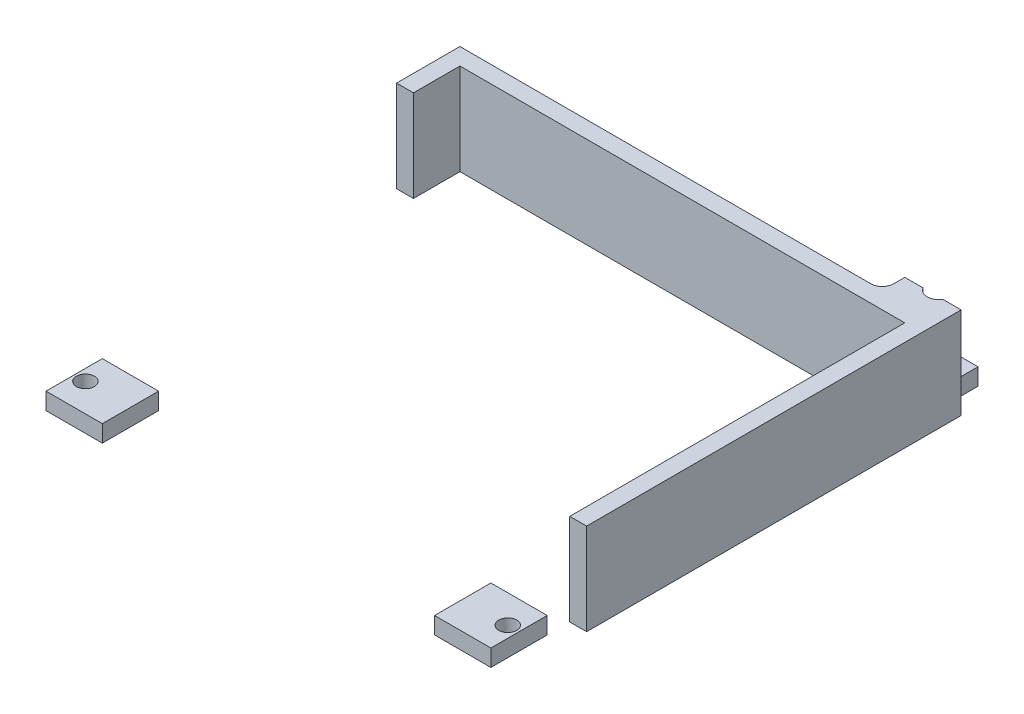
ISO-10303-21;
HEADER;
FILE_DESCRIPTION(('STEP AP214'),'2;1');
FILE_NAME('part.step','',(''),(''),'','','');
FILE_SCHEMA(('AUTOMOTIVE_DESIGN { 1 0 10303 214 1 1 1 1 }'));
ENDSEC;
DATA;
#1=APPLICATION_CONTEXT('core data for automotive mechanical design processes');
#2=APPLICATION_PROTOCOL_DEFINITION('international standard','automotive_design',2000,#1);
#3=PRODUCT_CONTEXT('',#1,'mechanical');
#4=PRODUCT('Part','Part','',(#3));
#5=PRODUCT_RELATED_PRODUCT_CATEGORY('part','',(#4));
#6=PRODUCT_DEFINITION_FORMATION('','',#4);
#7=PRODUCT_DEFINITION_CONTEXT('part definition',#1,'design');
#8=PRODUCT_DEFINITION('design','',#6,#7);
#9=PRODUCT_DEFINITION_SHAPE('','',#8);
#10=(LENGTH_UNIT() NAMED_UNIT(*) SI_UNIT(.MILLI.,.METRE.));
#11=(NAMED_UNIT(*) PLANE_ANGLE_UNIT() SI_UNIT($,.RADIAN.));
#12=(NAMED_UNIT(*) SI_UNIT($,.STERADIAN.) SOLID_ANGLE_UNIT());
#13=UNCERTAINTY_MEASURE_WITH_UNIT(LENGTH_MEASURE(1.E-05),#10,'distance_accuracy_value','');
#14=(GEOMETRIC_REPRESENTATION_CONTEXT(3) GLOBAL_UNCERTAINTY_ASSIGNED_CONTEXT((#13)) GLOBAL_UNIT_ASSIGNED_CONTEXT((#10,
#11,#12)) REPRESENTATION_CONTEXT('',''));
#15=CARTESIAN_POINT('',(0.,0.,0.));
#16=DIRECTION('',(0.,0.,1.));
#17=DIRECTION('',(1.,0.,0.));
#18=AXIS2_PLACEMENT_3D('',#15,#16,#17);
#19=CARTESIAN_POINT('',(29.5,11.6,33.25));
#20=DIRECTION('',(0.,0.,-1.));
#21=DIRECTION('',(-1.,0.,0.));
#22=AXIS2_PLACEMENT_3D('',#19,#20,#21);
#23=PLANE('',#22);
#24=DIRECTION('',(1.,0.,0.));
#25=VECTOR('',#24,1.);
#26=CARTESIAN_POINT('',(29.5,8.6,33.25));
#27=LINE('',#26,#25);
#28=CARTESIAN_POINT('',(29.5,8.6,33.25));
#29=VERTEX_POINT('',#28);
#30=CARTESIAN_POINT('',(39.5,8.6,33.25));
#31=VERTEX_POINT('',#30);
#32=EDGE_CURVE('E12',#29,#31,#27,.T.);
#33=ORIENTED_EDGE('',*,*,#32,.F.);
#34=DIRECTION('',(0.,-1.,0.));
#35=VECTOR('',#34,1.);
#36=CARTESIAN_POINT('',(29.5,11.6,33.25));
#37=LINE('',#36,#35);
#38=CARTESIAN_POINT('',(29.5,11.6,33.25));
#39=VERTEX_POINT('',#38);
#40=EDGE_CURVE('E100',#39,#29,#37,.T.);
#41=ORIENTED_EDGE('',*,*,#40,.F.);
#42=DIRECTION('',(1.,0.,0.));
#43=VECTOR('',#42,1.);
#44=CARTESIAN_POINT('',(29.5,11.6,33.25));
#45=LINE('',#44,#43);
#46=CARTESIAN_POINT('',(39.5,11.6,33.25));
#47=VERTEX_POINT('',#46);
#48=EDGE_CURVE('E56',#39,#47,#45,.T.);
#49=ORIENTED_EDGE('',*,*,#48,.T.);
#50=DIRECTION('',(0.,-1.,0.));
#51=VECTOR('',#50,1.);
#52=CARTESIAN_POINT('',(39.5,11.6,33.25));
#53=LINE('',#52,#51);
#54=EDGE_CURVE('E71',#47,#31,#53,.T.);
#55=ORIENTED_EDGE('',*,*,#54,.T.);
#56=EDGE_LOOP('',(#33,#41,#49,#55));
#57=FACE_BOUND('',#56,.T.);
#58=ADVANCED_FACE('F52',(#57),#23,.T.);
#59=CARTESIAN_POINT('',(29.5,11.6,43.25));
#60=DIRECTION('',(-1.,0.,0.));
#61=DIRECTION('',(0.,0.,1.));
#62=AXIS2_PLACEMENT_3D('',#59,#60,#61);
#63=PLANE('',#62);
#64=DIRECTION('',(0.,0.,-1.));
#65=VECTOR('',#64,1.);
#66=CARTESIAN_POINT('',(29.5,8.6,43.25));
#67=LINE('',#66,#65);
#68=CARTESIAN_POINT('',(29.5,8.6,43.25));
#69=VERTEX_POINT('',#68);
#70=EDGE_CURVE('E114',#69,#29,#67,.T.);
#71=ORIENTED_EDGE('',*,*,#70,.F.);
#72=DIRECTION('',(0.,-1.,0.));
#73=VECTOR('',#72,1.);
#74=CARTESIAN_POINT('',(29.5,11.6,43.25));
#75=LINE('',#74,#73);
#76=CARTESIAN_POINT('',(29.5,11.6,43.25));
#77=VERTEX_POINT('',#76);
#78=EDGE_CURVE('E103',#77,#69,#75,.T.);
#79=ORIENTED_EDGE('',*,*,#78,.F.);
#80=DIRECTION('',(0.,0.,-1.));
#81=VECTOR('',#80,1.);
#82=CARTESIAN_POINT('',(29.5,11.6,43.25));
#83=LINE('',#82,#81);
#84=EDGE_CURVE('E121',#77,#39,#83,.T.);
#85=ORIENTED_EDGE('',*,*,#84,.T.);
#86=ORIENTED_EDGE('',*,*,#40,.T.);
#87=EDGE_LOOP('',(#71,#79,#85,#86));
#88=FACE_BOUND('',#87,.T.);
#89=ADVANCED_FACE('F116',(#88),#63,.T.);
#90=CARTESIAN_POINT('',(29.5,11.6,43.25));
#91=DIRECTION('',(0.,0.,-1.));
#92=DIRECTION('',(-1.,0.,0.));
#93=AXIS2_PLACEMENT_3D('',#90,#91,#92);
#94=PLANE('',#93);
#95=DIRECTION('',(1.,0.,0.));
#96=VECTOR('',#95,1.);
#97=CARTESIAN_POINT('',(29.5,8.6,43.25));
#98=LINE('',#97,#96);
#99=CARTESIAN_POINT('',(39.5,8.6,43.25));
#100=VERTEX_POINT('',#99);
#101=EDGE_CURVE('E106',#69,#100,#98,.T.);
#102=ORIENTED_EDGE('',*,*,#101,.T.);
#103=DIRECTION('',(0.,-1.,0.));
#104=VECTOR('',#103,1.);
#105=CARTESIAN_POINT('',(39.5,11.6,43.25));
#106=LINE('',#105,#104);
#107=CARTESIAN_POINT('',(39.5,11.6,43.25));
#108=VERTEX_POINT('',#107);
#109=EDGE_CURVE('E108',#108,#100,#106,.T.);
#110=ORIENTED_EDGE('',*,*,#109,.F.);
#111=DIRECTION('',(1.,0.,0.));
#112=VECTOR('',#111,1.);
#113=CARTESIAN_POINT('',(29.5,11.6,43.25));
#114=LINE('',#113,#112);
#115=EDGE_CURVE('E89',#77,#108,#114,.T.);
#116=ORIENTED_EDGE('',*,*,#115,.F.);
#117=ORIENTED_EDGE('',*,*,#78,.T.);
#118=EDGE_LOOP('',(#102,#110,#116,#117));
#119=FACE_BOUND('',#118,.T.);
#120=ADVANCED_FACE('F105',(#119),#94,.F.);
#121=CARTESIAN_POINT('',(39.5,11.6,43.25));
#122=DIRECTION('',(-1.,0.,0.));
#123=DIRECTION('',(0.,0.,1.));
#124=AXIS2_PLACEMENT_3D('',#121,#122,#123);
#125=PLANE('',#124);
#126=DIRECTION('',(0.,0.,-1.));
#127=VECTOR('',#126,1.);
#128=CARTESIAN_POINT('',(39.5,8.6,43.25));
#129=LINE('',#128,#127);
#130=EDGE_CURVE('E62',#100,#31,#129,.T.);
#131=ORIENTED_EDGE('',*,*,#130,.T.);
#132=ORIENTED_EDGE('',*,*,#54,.F.);
#133=DIRECTION('',(0.,0.,-1.));
#134=VECTOR('',#133,1.);
#135=CARTESIAN_POINT('',(39.5,11.6,43.25));
#136=LINE('',#135,#134);
#137=EDGE_CURVE('E94',#108,#47,#136,.T.);
#138=ORIENTED_EDGE('',*,*,#137,.F.);
#139=ORIENTED_EDGE('',*,*,#109,.T.);
#140=EDGE_LOOP('',(#131,#132,#138,#139));
#141=FACE_BOUND('',#140,.T.);
#142=ADVANCED_FACE('F136',(#141),#125,.F.);
#143=CARTESIAN_POINT('',(0.,11.6,0.));
#144=DIRECTION('',(0.,1.,0.));
#145=DIRECTION('',(0.,0.,1.));
#146=AXIS2_PLACEMENT_3D('',#143,#144,#145);
#147=PLANE('',#146);
#148=CARTESIAN_POINT('',(37.5,11.6,38.25));
#149=DIRECTION('',(0.,1.,0.));
#150=DIRECTION('',(0.,0.,1.));
#151=AXIS2_PLACEMENT_3D('',#148,#149,#150);
#152=CIRCLE('',#151,1.6);
#153=CARTESIAN_POINT('',(37.5,11.6,39.85));
#154=VERTEX_POINT('',#153);
#155=EDGE_CURVE('E129',#154,#154,#152,.T.);
#156=ORIENTED_EDGE('',*,*,#155,.F.);
#157=EDGE_LOOP('',(#156));
#158=FACE_BOUND('',#157,.T.);
#159=ORIENTED_EDGE('',*,*,#48,.F.);
#160=ORIENTED_EDGE('',*,*,#84,.F.);
#161=ORIENTED_EDGE('',*,*,#115,.T.);
#162=ORIENTED_EDGE('',*,*,#137,.T.);
#163=EDGE_LOOP('',(#159,#160,#161,#162));
#164=FACE_BOUND('',#163,.T.);
#165=ADVANCED_FACE('F54',(#158,#164),#147,.T.);
#166=CARTESIAN_POINT('',(0.,8.6,0.));
#167=DIRECTION('',(0.,1.,0.));
#168=DIRECTION('',(0.,0.,1.));
#169=AXIS2_PLACEMENT_3D('',#166,#167,#168);
#170=PLANE('',#169);
#171=CARTESIAN_POINT('',(37.5,8.6,38.25));
#172=DIRECTION('',(0.,1.,0.));
#173=DIRECTION('',(0.,0.,1.));
#174=AXIS2_PLACEMENT_3D('',#171,#172,#173);
#175=CIRCLE('',#174,1.6);
#176=CARTESIAN_POINT('',(37.5,8.6,39.85));
#177=VERTEX_POINT('',#176);
#178=EDGE_CURVE('E126',#177,#177,#175,.T.);
#179=ORIENTED_EDGE('',*,*,#178,.T.);
#180=EDGE_LOOP('',(#179));
#181=FACE_BOUND('',#180,.T.);
#182=ORIENTED_EDGE('',*,*,#32,.T.);
#183=ORIENTED_EDGE('',*,*,#130,.F.);
#184=ORIENTED_EDGE('',*,*,#101,.F.);
#185=ORIENTED_EDGE('',*,*,#70,.T.);
#186=EDGE_LOOP('',(#182,#183,#184,#185));
#187=FACE_BOUND('',#186,.T.);
#188=ADVANCED_FACE('F113',(#181,#187),#170,.F.);
#189=CARTESIAN_POINT('',(37.5,11.6,38.25));
#190=DIRECTION('',(0.,1.,0.));
#191=DIRECTION('',(0.,0.,1.));
#192=AXIS2_PLACEMENT_3D('',#189,#190,#191);
#193=CYLINDRICAL_SURFACE('',#192,1.6);
#194=ORIENTED_EDGE('',*,*,#178,.F.);
#195=EDGE_LOOP('',(#194));
#196=FACE_BOUND('',#195,.T.);
#197=ORIENTED_EDGE('',*,*,#155,.T.);
#198=EDGE_LOOP('',(#197));
#199=FACE_BOUND('',#198,.T.);
#200=ADVANCED_FACE('F133',(#196,#199),#193,.F.);
#201=CLOSED_SHELL('',(#58,#89,#120,#142,#165,#188,#200));
#202=MANIFOLD_SOLID_BREP('B2',#201);
#203=CARTESIAN_POINT('',(-39.5,11.6,33.25));
#204=DIRECTION('',(0.,0.,-1.));
#205=DIRECTION('',(-1.,0.,0.));
#206=AXIS2_PLACEMENT_3D('',#203,#204,#205);
#207=PLANE('',#206);
#208=DIRECTION('',(1.,0.,0.));
#209=VECTOR('',#208,1.);
#210=CARTESIAN_POINT('',(-39.5,8.6,33.25));
#211=LINE('',#210,#209);
#212=CARTESIAN_POINT('',(-39.5,8.6,33.25));
#213=VERTEX_POINT('',#212);
#214=CARTESIAN_POINT('',(-29.5,8.6,33.25));
#215=VERTEX_POINT('',#214);
#216=EDGE_CURVE('E50',#213,#215,#211,.T.);
#217=ORIENTED_EDGE('',*,*,#216,.F.);
#218=DIRECTION('',(0.,-1.,0.));
#219=VECTOR('',#218,1.);
#220=CARTESIAN_POINT('',(-39.5,11.6,33.25));
#221=LINE('',#220,#219);
#222=CARTESIAN_POINT('',(-39.5,11.6,33.25));
#223=VERTEX_POINT('',#222);
#224=EDGE_CURVE('E268',#223,#213,#221,.T.);
#225=ORIENTED_EDGE('',*,*,#224,.F.);
#226=DIRECTION('',(1.,0.,0.));
#227=VECTOR('',#226,1.);
#228=CARTESIAN_POINT('',(-39.5,11.6,33.25));
#229=LINE('',#228,#227);
#230=CARTESIAN_POINT('',(-29.5,11.6,33.25));
#231=VERTEX_POINT('',#230);
#232=EDGE_CURVE('E224',#223,#231,#229,.T.);
#233=ORIENTED_EDGE('',*,*,#232,.T.);
#234=DIRECTION('',(0.,-1.,0.));
#235=VECTOR('',#234,1.);
#236=CARTESIAN_POINT('',(-29.5,11.6,33.25));
#237=LINE('',#236,#235);
#238=EDGE_CURVE('E239',#231,#215,#237,.T.);
#239=ORIENTED_EDGE('',*,*,#238,.T.);
#240=EDGE_LOOP('',(#217,#225,#233,#239));
#241=FACE_BOUND('',#240,.T.);
#242=ADVANCED_FACE('F220',(#241),#207,.T.);
#243=CARTESIAN_POINT('',(-39.5,11.6,43.25));
#244=DIRECTION('',(-1.,0.,0.));
#245=DIRECTION('',(0.,0.,1.));
#246=AXIS2_PLACEMENT_3D('',#243,#244,#245);
#247=PLANE('',#246);
#248=DIRECTION('',(0.,0.,-1.));
#249=VECTOR('',#248,1.);
#250=CARTESIAN_POINT('',(-39.5,8.6,43.25));
#251=LINE('',#250,#249);
#252=CARTESIAN_POINT('',(-39.5,8.6,43.25));
#253=VERTEX_POINT('',#252);
#254=EDGE_CURVE('E282',#253,#213,#251,.T.);
#255=ORIENTED_EDGE('',*,*,#254,.F.);
#256=DIRECTION('',(0.,-1.,0.));
#257=VECTOR('',#256,1.);
#258=CARTESIAN_POINT('',(-39.5,11.6,43.25));
#259=LINE('',#258,#257);
#260=CARTESIAN_POINT('',(-39.5,11.6,43.25));
#261=VERTEX_POINT('',#260);
#262=EDGE_CURVE('E271',#261,#253,#259,.T.);
#263=ORIENTED_EDGE('',*,*,#262,.F.);
#264=DIRECTION('',(0.,0.,-1.));
#265=VECTOR('',#264,1.);
#266=CARTESIAN_POINT('',(-39.5,11.6,43.25));
#267=LINE('',#266,#265);
#268=EDGE_CURVE('E289',#261,#223,#267,.T.);
#269=ORIENTED_EDGE('',*,*,#268,.T.);
#270=ORIENTED_EDGE('',*,*,#224,.T.);
#271=EDGE_LOOP('',(#255,#263,#269,#270));
#272=FACE_BOUND('',#271,.T.);
#273=ADVANCED_FACE('F284',(#272),#247,.T.);
#274=CARTESIAN_POINT('',(-39.5,11.6,43.25));
#275=DIRECTION('',(0.,0.,-1.));
#276=DIRECTION('',(-1.,0.,0.));
#277=AXIS2_PLACEMENT_3D('',#274,#275,#276);
#278=PLANE('',#277);
#279=DIRECTION('',(1.,0.,0.));
#280=VECTOR('',#279,1.);
#281=CARTESIAN_POINT('',(-39.5,8.6,43.25));
#282=LINE('',#281,#280);
#283=CARTESIAN_POINT('',(-29.5,8.6,43.25));
#284=VERTEX_POINT('',#283);
#285=EDGE_CURVE('E274',#253,#284,#282,.T.);
#286=ORIENTED_EDGE('',*,*,#285,.T.);
#287=DIRECTION('',(0.,-1.,0.));
#288=VECTOR('',#287,1.);
#289=CARTESIAN_POINT('',(-29.5,11.6,43.25));
#290=LINE('',#289,#288);
#291=CARTESIAN_POINT('',(-29.5,11.6,43.25));
#292=VERTEX_POINT('',#291);
#293=EDGE_CURVE('E276',#292,#284,#290,.T.);
#294=ORIENTED_EDGE('',*,*,#293,.F.);
#295=DIRECTION('',(1.,0.,0.));
#296=VECTOR('',#295,1.);
#297=CARTESIAN_POINT('',(-39.5,11.6,43.25));
#298=LINE('',#297,#296);
#299=EDGE_CURVE('E257',#261,#292,#298,.T.);
#300=ORIENTED_EDGE('',*,*,#299,.F.);
#301=ORIENTED_EDGE('',*,*,#262,.T.);
#302=EDGE_LOOP('',(#286,#294,#300,#301));
#303=FACE_BOUND('',#302,.T.);
#304=ADVANCED_FACE('F273',(#303),#278,.F.);
#305=CARTESIAN_POINT('',(-29.5,11.6,43.25));
#306=DIRECTION('',(-1.,0.,0.));
#307=DIRECTION('',(0.,0.,1.));
#308=AXIS2_PLACEMENT_3D('',#305,#306,#307);
#309=PLANE('',#308);
#310=DIRECTION('',(0.,0.,-1.));
#311=VECTOR('',#310,1.);
#312=CARTESIAN_POINT('',(-29.5,8.6,43.25));
#313=LINE('',#312,#311);
#314=EDGE_CURVE('E230',#284,#215,#313,.T.);
#315=ORIENTED_EDGE('',*,*,#314,.T.);
#316=ORIENTED_EDGE('',*,*,#238,.F.);
#317=DIRECTION('',(0.,0.,-1.));
#318=VECTOR('',#317,1.);
#319=CARTESIAN_POINT('',(-29.5,11.6,43.25));
#320=LINE('',#319,#318);
#321=EDGE_CURVE('E262',#292,#231,#320,.T.);
#322=ORIENTED_EDGE('',*,*,#321,.F.);
#323=ORIENTED_EDGE('',*,*,#293,.T.);
#324=EDGE_LOOP('',(#315,#316,#322,#323));
#325=FACE_BOUND('',#324,.T.);
#326=ADVANCED_FACE('F304',(#325),#309,.F.);
#327=CARTESIAN_POINT('',(0.,11.6,0.));
#328=DIRECTION('',(0.,1.,0.));
#329=DIRECTION('',(0.,0.,1.));
#330=AXIS2_PLACEMENT_3D('',#327,#328,#329);
#331=PLANE('',#330);
#332=CARTESIAN_POINT('',(-37.5,11.6,38.25));
#333=DIRECTION('',(0.,1.,0.));
#334=DIRECTION('',(0.,0.,1.));
#335=AXIS2_PLACEMENT_3D('',#332,#333,#334);
#336=CIRCLE('',#335,1.6);
#337=CARTESIAN_POINT('',(-37.5,11.6,39.85));
#338=VERTEX_POINT('',#337);
#339=EDGE_CURVE('E297',#338,#338,#336,.T.);
#340=ORIENTED_EDGE('',*,*,#339,.F.);
#341=EDGE_LOOP('',(#340));
#342=FACE_BOUND('',#341,.T.);
#343=ORIENTED_EDGE('',*,*,#232,.F.);
#344=ORIENTED_EDGE('',*,*,#268,.F.);
#345=ORIENTED_EDGE('',*,*,#299,.T.);
#346=ORIENTED_EDGE('',*,*,#321,.T.);
#347=EDGE_LOOP('',(#343,#344,#345,#346));
#348=FACE_BOUND('',#347,.T.);
#349=ADVANCED_FACE('F222',(#342,#348),#331,.T.);
#350=CARTESIAN_POINT('',(0.,8.6,0.));
#351=DIRECTION('',(0.,1.,0.));
#352=DIRECTION('',(0.,0.,1.));
#353=AXIS2_PLACEMENT_3D('',#350,#351,#352);
#354=PLANE('',#353);
#355=CARTESIAN_POINT('',(-37.5,8.6,38.25));
#356=DIRECTION('',(0.,1.,0.));
#357=DIRECTION('',(0.,0.,1.));
#358=AXIS2_PLACEMENT_3D('',#355,#356,#357);
#359=CIRCLE('',#358,1.6);
#360=CARTESIAN_POINT('',(-37.5,8.6,39.85));
#361=VERTEX_POINT('',#360);
#362=EDGE_CURVE('E294',#361,#361,#359,.T.);
#363=ORIENTED_EDGE('',*,*,#362,.T.);
#364=EDGE_LOOP('',(#363));
#365=FACE_BOUND('',#364,.T.);
#366=ORIENTED_EDGE('',*,*,#216,.T.);
#367=ORIENTED_EDGE('',*,*,#314,.F.);
#368=ORIENTED_EDGE('',*,*,#285,.F.);
#369=ORIENTED_EDGE('',*,*,#254,.T.);
#370=EDGE_LOOP('',(#366,#367,#368,#369));
#371=FACE_BOUND('',#370,.T.);
#372=ADVANCED_FACE('F281',(#365,#371),#354,.F.);
#373=CARTESIAN_POINT('',(-37.5,11.6,38.25));
#374=DIRECTION('',(0.,1.,0.));
#375=DIRECTION('',(0.,0.,1.));
#376=AXIS2_PLACEMENT_3D('',#373,#374,#375);
#377=CYLINDRICAL_SURFACE('',#376,1.6);
#378=ORIENTED_EDGE('',*,*,#362,.F.);
#379=EDGE_LOOP('',(#378));
#380=FACE_BOUND('',#379,.T.);
#381=ORIENTED_EDGE('',*,*,#339,.T.);
#382=EDGE_LOOP('',(#381));
#383=FACE_BOUND('',#382,.T.);
#384=ADVANCED_FACE('F301',(#380,#383),#377,.F.);
#385=CLOSED_SHELL('',(#242,#273,#304,#326,#349,#372,#384));
#386=MANIFOLD_SOLID_BREP('B6',#385);
#387=CARTESIAN_POINT('',(0.,24.85,-33.25));
#388=DIRECTION('',(0.,0.,1.));
#389=DIRECTION('',(1.,0.,0.));
#390=AXIS2_PLACEMENT_3D('',#387,#388,#389);
#391=PLANE('',#390);
#392=DIRECTION('',(0.,-1.,0.));
#393=VECTOR('',#392,1.);
#394=CARTESIAN_POINT('',(29.5,11.6,-33.25));
#395=LINE('',#394,#393);
#396=CARTESIAN_POINT('',(29.5,11.6,-33.25));
#397=VERTEX_POINT('',#396);
#398=CARTESIAN_POINT('',(29.5,8.6,-33.25));
#399=VERTEX_POINT('',#398);
#400=EDGE_CURVE('E551',#397,#399,#395,.T.);
#401=ORIENTED_EDGE('',*,*,#400,.T.);
#402=DIRECTION('',(-1.,0.,0.));
#403=VECTOR('',#402,1.);
#404=CARTESIAN_POINT('',(0.,8.6,-33.25));
#405=LINE('',#404,#403);
#406=CARTESIAN_POINT('',(-29.5,8.6,-33.25));
#407=VERTEX_POINT('',#406);
#408=EDGE_CURVE('E636',#399,#407,#405,.T.);
#409=ORIENTED_EDGE('',*,*,#408,.T.);
#410=DIRECTION('',(0.,-1.,0.));
#411=VECTOR('',#410,1.);
#412=CARTESIAN_POINT('',(-29.5,11.6,-33.25));
#413=LINE('',#412,#411);
#414=CARTESIAN_POINT('',(-29.5,11.6,-33.25));
#415=VERTEX_POINT('',#414);
#416=EDGE_CURVE('E593',#415,#407,#413,.T.);
#417=ORIENTED_EDGE('',*,*,#416,.F.);
#418=DIRECTION('',(1.,0.,0.));
#419=VECTOR('',#418,1.);
#420=CARTESIAN_POINT('',(-39.5,11.6,-33.25));
#421=LINE('',#420,#419);
#422=CARTESIAN_POINT('',(-39.5,11.6,-33.25));
#423=VERTEX_POINT('',#422);
#424=EDGE_CURVE('E573',#423,#415,#421,.T.);
#425=ORIENTED_EDGE('',*,*,#424,.F.);
#426=DIRECTION('',(0.,-1.,0.));
#427=VECTOR('',#426,1.);
#428=CARTESIAN_POINT('',(-39.5,11.6,-33.25));
#429=LINE('',#428,#427);
#430=CARTESIAN_POINT('',(-39.5,8.6,-33.25));
#431=VERTEX_POINT('',#430);
#432=EDGE_CURVE('E590',#423,#431,#429,.T.);
#433=ORIENTED_EDGE('',*,*,#432,.T.);
#434=CARTESIAN_POINT('',(-42.5,8.6,-33.25));
#435=VERTEX_POINT('',#434);
#436=EDGE_CURVE('E635',#431,#435,#405,.T.);
#437=ORIENTED_EDGE('',*,*,#436,.T.);
#438=DIRECTION('',(0.,-1.,0.));
#439=VECTOR('',#438,1.);
#440=CARTESIAN_POINT('',(-42.5,24.85,-33.25));
#441=LINE('',#440,#439);
#442=CARTESIAN_POINT('',(-42.5,24.85,-33.25));
#443=VERTEX_POINT('',#442);
#444=EDGE_CURVE('E656',#443,#435,#441,.T.);
#445=ORIENTED_EDGE('',*,*,#444,.F.);
#446=DIRECTION('',(-1.,0.,0.));
#447=VECTOR('',#446,1.);
#448=CARTESIAN_POINT('',(0.,24.85,-33.25));
#449=LINE('',#448,#447);
#450=CARTESIAN_POINT('',(30.5,24.85,-33.25));
#451=VERTEX_POINT('',#450);
#452=EDGE_CURVE('E615',#451,#443,#449,.T.);
#453=ORIENTED_EDGE('',*,*,#452,.F.);
#454=DIRECTION('',(0.,-1.,0.));
#455=VECTOR('',#454,1.);
#456=CARTESIAN_POINT('',(30.5,24.85,-33.25));
#457=LINE('',#456,#455);
#458=CARTESIAN_POINT('',(30.5,11.6,-33.25));
#459=VERTEX_POINT('',#458);
#460=EDGE_CURVE('E659',#451,#459,#457,.T.);
#461=ORIENTED_EDGE('',*,*,#460,.T.);
#462=DIRECTION('',(-1.,0.,0.));
#463=VECTOR('',#462,1.);
#464=CARTESIAN_POINT('',(39.5,11.6,-33.25));
#465=LINE('',#464,#463);
#466=EDGE_CURVE('E542',#459,#397,#465,.T.);
#467=ORIENTED_EDGE('',*,*,#466,.T.);
#468=EDGE_LOOP('',(#401,#409,#417,#425,#433,#437,#445,#453,#461,#467));
#469=FACE_BOUND('',#468,.T.);
#470=ADVANCED_FACE('F379',(#469),#391,.F.);
#471=CARTESIAN_POINT('',(39.5,24.85,0.));
#472=DIRECTION('',(1.,0.,0.));
#473=DIRECTION('',(0.,0.,-1.));
#474=AXIS2_PLACEMENT_3D('',#471,#472,#473);
#475=PLANE('',#474);
#476=DIRECTION('',(0.,0.,1.));
#477=VECTOR('',#476,1.);
#478=CARTESIAN_POINT('',(39.5,8.6,0.));
#479=LINE('',#478,#477);
#480=CARTESIAN_POINT('',(39.5,8.6,-30.25));
#481=VERTEX_POINT('',#480);
#482=CARTESIAN_POINT('',(39.5,8.6,29.25));
#483=VERTEX_POINT('',#482);
#484=EDGE_CURVE('E589',#481,#483,#479,.T.);
#485=ORIENTED_EDGE('',*,*,#484,.T.);
#486=DIRECTION('',(0.,-1.,0.));
#487=VECTOR('',#486,1.);
#488=CARTESIAN_POINT('',(39.5,24.85,29.25));
#489=LINE('',#488,#487);
#490=CARTESIAN_POINT('',(39.5,24.85,29.25));
#491=VERTEX_POINT('',#490);
#492=EDGE_CURVE('E218',#491,#483,#489,.T.);
#493=ORIENTED_EDGE('',*,*,#492,.F.);
#494=DIRECTION('',(0.,0.,1.));
#495=VECTOR('',#494,1.);
#496=CARTESIAN_POINT('',(39.5,24.85,0.));
#497=LINE('',#496,#495);
#498=CARTESIAN_POINT('',(39.5,24.85,-30.25));
#499=VERTEX_POINT('',#498);
#500=EDGE_CURVE('E597',#499,#491,#497,.T.);
#501=ORIENTED_EDGE('',*,*,#500,.F.);
#502=DIRECTION('',(0.,-1.,0.));
#503=VECTOR('',#502,1.);
#504=CARTESIAN_POINT('',(39.5,24.85,-30.25));
#505=LINE('',#504,#503);
#506=EDGE_CURVE('E625',#499,#481,#505,.T.);
#507=ORIENTED_EDGE('',*,*,#506,.T.);
#508=EDGE_LOOP('',(#485,#493,#501,#507));
#509=FACE_BOUND('',#508,.T.);
#510=ADVANCED_FACE('F381',(#509),#475,.F.);
#511=CARTESIAN_POINT('',(0.,24.85,29.25));
#512=DIRECTION('',(0.,0.,-1.));
#513=DIRECTION('',(-1.,0.,0.));
#514=AXIS2_PLACEMENT_3D('',#511,#512,#513);
#515=PLANE('',#514);
#516=DIRECTION('',(1.,0.,0.));
#517=VECTOR('',#516,1.);
#518=CARTESIAN_POINT('',(0.,8.6,29.25));
#519=LINE('',#518,#517);
#520=CARTESIAN_POINT('',(42.5,8.6,29.25));
#521=VERTEX_POINT('',#520);
#522=EDGE_CURVE('E628',#483,#521,#519,.T.);
#523=ORIENTED_EDGE('',*,*,#522,.T.);
#524=DIRECTION('',(0.,-1.,0.));
#525=VECTOR('',#524,1.);
#526=CARTESIAN_POINT('',(42.5,24.85,29.25));
#527=LINE('',#526,#525);
#528=CARTESIAN_POINT('',(42.5,24.85,29.25));
#529=VERTEX_POINT('',#528);
#530=EDGE_CURVE('E387',#529,#521,#527,.T.);
#531=ORIENTED_EDGE('',*,*,#530,.F.);
#532=DIRECTION('',(1.,0.,0.));
#533=VECTOR('',#532,1.);
#534=CARTESIAN_POINT('',(0.,24.85,29.25));
#535=LINE('',#534,#533);
#536=EDGE_CURVE('E600',#491,#529,#535,.T.);
#537=ORIENTED_EDGE('',*,*,#536,.F.);
#538=ORIENTED_EDGE('',*,*,#492,.T.);
#539=EDGE_LOOP('',(#523,#531,#537,#538));
#540=FACE_BOUND('',#539,.T.);
#541=ADVANCED_FACE('F693',(#540),#515,.F.);
#542=CARTESIAN_POINT('',(42.5,24.85,0.));
#543=DIRECTION('',(-1.,0.,0.));
#544=DIRECTION('',(0.,0.,1.));
#545=AXIS2_PLACEMENT_3D('',#542,#543,#544);
#546=PLANE('',#545);
#547=DIRECTION('',(0.,0.,-1.));
#548=VECTOR('',#547,1.);
#549=CARTESIAN_POINT('',(42.5,8.6,0.));
#550=LINE('',#549,#548);
#551=CARTESIAN_POINT('',(42.5,8.6,-37.25));
#552=VERTEX_POINT('',#551);
#553=EDGE_CURVE('E630',#521,#552,#550,.T.);
#554=ORIENTED_EDGE('',*,*,#553,.T.);
#555=DIRECTION('',(0.,-1.,0.));
#556=VECTOR('',#555,1.);
#557=CARTESIAN_POINT('',(42.5,24.85,-37.25));
#558=LINE('',#557,#556);
#559=CARTESIAN_POINT('',(42.5,24.85,-37.25));
#560=VERTEX_POINT('',#559);
#561=EDGE_CURVE('E673',#560,#552,#558,.T.);
#562=ORIENTED_EDGE('',*,*,#561,.F.);
#563=DIRECTION('',(0.,0.,-1.));
#564=VECTOR('',#563,1.);
#565=CARTESIAN_POINT('',(42.5,24.85,0.));
#566=LINE('',#565,#564);
#567=EDGE_CURVE('E603',#529,#560,#566,.T.);
#568=ORIENTED_EDGE('',*,*,#567,.F.);
#569=ORIENTED_EDGE('',*,*,#530,.T.);
#570=EDGE_LOOP('',(#554,#562,#568,#569));
#571=FACE_BOUND('',#570,.T.);
#572=ADVANCED_FACE('F680',(#571),#546,.F.);
#573=CARTESIAN_POINT('',(0.,24.85,-37.25));
#574=DIRECTION('',(0.,0.,-1.));
#575=DIRECTION('',(-1.,0.,0.));
#576=AXIS2_PLACEMENT_3D('',#573,#574,#575);
#577=PLANE('',#576);
#578=DIRECTION('',(0.,-1.,0.));
#579=VECTOR('',#578,1.);
#580=CARTESIAN_POINT('',(39.5,24.85,-37.25));
#581=LINE('',#580,#579);
#582=CARTESIAN_POINT('',(39.5,11.6,-37.25));
#583=VERTEX_POINT('',#582);
#584=CARTESIAN_POINT('',(39.5,8.6,-37.25));
#585=VERTEX_POINT('',#584);
#586=EDGE_CURVE('E394',#583,#585,#581,.T.);
#587=ORIENTED_EDGE('',*,*,#586,.F.);
#588=DIRECTION('',(1.,0.,0.));
#589=VECTOR('',#588,1.);
#590=CARTESIAN_POINT('',(0.,11.6,-37.25));
#591=LINE('',#590,#589);
#592=CARTESIAN_POINT('',(39.2320508075689,11.6,-37.25));
#593=VERTEX_POINT('',#592);
#594=EDGE_CURVE('E398',#593,#583,#591,.T.);
#595=ORIENTED_EDGE('',*,*,#594,.F.);
#596=DIRECTION('',(0.,-1.,0.));
#597=VECTOR('',#596,1.);
#598=CARTESIAN_POINT('',(39.2320508075689,24.85,-37.25));
#599=LINE('',#598,#597);
#600=CARTESIAN_POINT('',(39.2320508075689,24.85,-37.25));
#601=VERTEX_POINT('',#600);
#602=EDGE_CURVE('E671',#601,#593,#599,.T.);
#603=ORIENTED_EDGE('',*,*,#602,.F.);
#604=DIRECTION('',(1.,0.,0.));
#605=VECTOR('',#604,1.);
#606=CARTESIAN_POINT('',(0.,24.85,-37.25));
#607=LINE('',#606,#605);
#608=EDGE_CURVE('E605',#601,#560,#607,.T.);
#609=ORIENTED_EDGE('',*,*,#608,.T.);
#610=ORIENTED_EDGE('',*,*,#561,.T.);
#611=DIRECTION('',(1.,0.,0.));
#612=VECTOR('',#611,1.);
#613=CARTESIAN_POINT('',(0.,8.6,-37.25));
#614=LINE('',#613,#612);
#615=EDGE_CURVE('E633',#585,#552,#614,.T.);
#616=ORIENTED_EDGE('',*,*,#615,.F.);
#617=EDGE_LOOP('',(#587,#595,#603,#609,#610,#616));
#618=FACE_BOUND('',#617,.T.);
#619=ADVANCED_FACE('F684',(#618),#577,.T.);
#620=CARTESIAN_POINT('',(37.5,24.85,-38.25));
#621=DIRECTION('',(0.,-1.,0.));
#622=DIRECTION('',(0.,0.,-1.));
#623=AXIS2_PLACEMENT_3D('',#620,#621,#622);
#624=CYLINDRICAL_SURFACE('',#623,2.);
#625=ORIENTED_EDGE('',*,*,#602,.T.);
#626=CARTESIAN_POINT('',(37.5,11.6,-38.25));
#627=DIRECTION('',(0.,1.,0.));
#628=DIRECTION('',(0.,0.,1.));
#629=AXIS2_PLACEMENT_3D('',#626,#627,#628);
#630=CIRCLE('',#629,2.);
#631=CARTESIAN_POINT('',(35.7679491924311,11.6,-37.25));
#632=VERTEX_POINT('',#631);
#633=EDGE_CURVE('E563',#593,#632,#630,.F.);
#634=ORIENTED_EDGE('',*,*,#633,.T.);
#635=DIRECTION('',(0.,-1.,0.));
#636=VECTOR('',#635,1.);
#637=CARTESIAN_POINT('',(35.7679491924311,24.85,-37.25));
#638=LINE('',#637,#636);
#639=CARTESIAN_POINT('',(35.7679491924311,24.85,-37.25));
#640=VERTEX_POINT('',#639);
#641=EDGE_CURVE('E668',#640,#632,#638,.T.);
#642=ORIENTED_EDGE('',*,*,#641,.F.);
#643=CARTESIAN_POINT('',(37.5,24.85,-38.25));
#644=DIRECTION('',(0.,1.,0.));
#645=DIRECTION('',(0.,0.,1.));
#646=AXIS2_PLACEMENT_3D('',#643,#644,#645);
#647=CIRCLE('',#646,2.);
#648=EDGE_CURVE('E608',#601,#640,#647,.F.);
#649=ORIENTED_EDGE('',*,*,#648,.F.);
#650=EDGE_LOOP('',(#625,#634,#642,#649));
#651=FACE_BOUND('',#650,.T.);
#652=ADVANCED_FACE('F766',(#651),#624,.F.);
#653=DIRECTION('',(1.,0.,0.));
#654=VECTOR('',#653,1.);
#655=CARTESIAN_POINT('',(0.,11.6,-37.25));
#656=LINE('',#655,#654);
#657=CARTESIAN_POINT('',(32.5,11.6,-37.25));
#658=VERTEX_POINT('',#657);
#659=EDGE_CURVE('E560',#658,#632,#656,.T.);
#660=ORIENTED_EDGE('',*,*,#659,.F.);
#661=DIRECTION('',(0.,-1.,0.));
#662=VECTOR('',#661,1.);
#663=CARTESIAN_POINT('',(32.5,24.85,-37.25));
#664=LINE('',#663,#662);
#665=CARTESIAN_POINT('',(32.5,24.85,-37.25));
#666=VERTEX_POINT('',#665);
#667=EDGE_CURVE('E665',#666,#658,#664,.T.);
#668=ORIENTED_EDGE('',*,*,#667,.F.);
#669=EDGE_CURVE('E609',#666,#640,#607,.T.);
#670=ORIENTED_EDGE('',*,*,#669,.T.);
#671=ORIENTED_EDGE('',*,*,#641,.T.);
#672=EDGE_LOOP('',(#660,#668,#670,#671));
#673=FACE_BOUND('',#672,.T.);
#674=ADVANCED_FACE('F762',(#673),#577,.T.);
#675=CARTESIAN_POINT('',(32.5,24.85,0.));
#676=DIRECTION('',(1.,0.,0.));
#677=DIRECTION('',(0.,0.,-1.));
#678=AXIS2_PLACEMENT_3D('',#675,#676,#677);
#679=PLANE('',#678);
#680=ORIENTED_EDGE('',*,*,#667,.T.);
#681=DIRECTION('',(0.,0.,1.));
#682=VECTOR('',#681,1.);
#683=CARTESIAN_POINT('',(32.5,11.6,0.));
#684=LINE('',#683,#682);
#685=CARTESIAN_POINT('',(32.5,11.6,-35.25));
#686=VERTEX_POINT('',#685);
#687=EDGE_CURVE('E558',#658,#686,#684,.T.);
#688=ORIENTED_EDGE('',*,*,#687,.T.);
#689=DIRECTION('',(0.,-1.,0.));
#690=VECTOR('',#689,1.);
#691=CARTESIAN_POINT('',(32.5,24.85,-35.25));
#692=LINE('',#691,#690);
#693=CARTESIAN_POINT('',(32.5,24.85,-35.25));
#694=VERTEX_POINT('',#693);
#695=EDGE_CURVE('E662',#694,#686,#692,.T.);
#696=ORIENTED_EDGE('',*,*,#695,.F.);
#697=DIRECTION('',(0.,0.,1.));
#698=VECTOR('',#697,1.);
#699=CARTESIAN_POINT('',(32.5,24.85,0.));
#700=LINE('',#699,#698);
#701=EDGE_CURVE('E611',#666,#694,#700,.T.);
#702=ORIENTED_EDGE('',*,*,#701,.F.);
#703=EDGE_LOOP('',(#680,#688,#696,#702));
#704=FACE_BOUND('',#703,.T.);
#705=ADVANCED_FACE('F758',(#704),#679,.F.);
#706=CARTESIAN_POINT('',(30.5,24.85,-35.25));
#707=DIRECTION('',(0.,-1.,0.));
#708=DIRECTION('',(0.,0.,-1.));
#709=AXIS2_PLACEMENT_3D('',#706,#707,#708);
#710=CYLINDRICAL_SURFACE('',#709,2.);
#711=ORIENTED_EDGE('',*,*,#695,.T.);
#712=CARTESIAN_POINT('',(30.5,11.6,-35.25));
#713=DIRECTION('',(0.,1.,0.));
#714=DIRECTION('',(0.,0.,1.));
#715=AXIS2_PLACEMENT_3D('',#712,#713,#714);
#716=CIRCLE('',#715,2.);
#717=EDGE_CURVE('E556',#686,#459,#716,.F.);
#718=ORIENTED_EDGE('',*,*,#717,.T.);
#719=ORIENTED_EDGE('',*,*,#460,.F.);
#720=CARTESIAN_POINT('',(30.5,24.85,-35.25));
#721=DIRECTION('',(0.,1.,0.));
#722=DIRECTION('',(0.,0.,1.));
#723=AXIS2_PLACEMENT_3D('',#720,#721,#722);
#724=CIRCLE('',#723,2.);
#725=EDGE_CURVE('E613',#694,#451,#724,.F.);
#726=ORIENTED_EDGE('',*,*,#725,.F.);
#727=EDGE_LOOP('',(#711,#718,#719,#726));
#728=FACE_BOUND('',#727,.T.);
#729=ADVANCED_FACE('F755',(#728),#710,.F.);
#730=CARTESIAN_POINT('',(-42.5,24.85,0.));
#731=DIRECTION('',(1.,0.,0.));
#732=DIRECTION('',(0.,0.,-1.));
#733=AXIS2_PLACEMENT_3D('',#730,#731,#732);
#734=PLANE('',#733);
#735=DIRECTION('',(0.,0.,1.));
#736=VECTOR('',#735,1.);
#737=CARTESIAN_POINT('',(-42.5,8.6,0.));
#738=LINE('',#737,#736);
#739=CARTESIAN_POINT('',(-42.5,8.6,-22.));
#740=VERTEX_POINT('',#739);
#741=EDGE_CURVE('E638',#435,#740,#738,.T.);
#742=ORIENTED_EDGE('',*,*,#741,.T.);
#743=DIRECTION('',(0.,-1.,0.));
#744=VECTOR('',#743,1.);
#745=CARTESIAN_POINT('',(-42.5,24.85,-22.));
#746=LINE('',#745,#744);
#747=CARTESIAN_POINT('',(-42.5,24.85,-22.));
#748=VERTEX_POINT('',#747);
#749=EDGE_CURVE('E653',#748,#740,#746,.T.);
#750=ORIENTED_EDGE('',*,*,#749,.F.);
#751=DIRECTION('',(0.,0.,1.));
#752=VECTOR('',#751,1.);
#753=CARTESIAN_POINT('',(-42.5,24.85,0.));
#754=LINE('',#753,#752);
#755=EDGE_CURVE('E617',#443,#748,#754,.T.);
#756=ORIENTED_EDGE('',*,*,#755,.F.);
#757=ORIENTED_EDGE('',*,*,#444,.T.);
#758=EDGE_LOOP('',(#742,#750,#756,#757));
#759=FACE_BOUND('',#758,.T.);
#760=ADVANCED_FACE('F713',(#759),#734,.F.);
#761=CARTESIAN_POINT('',(0.,24.85,-22.));
#762=DIRECTION('',(0.,0.,-1.));
#763=DIRECTION('',(-1.,0.,0.));
#764=AXIS2_PLACEMENT_3D('',#761,#762,#763);
#765=PLANE('',#764);
#766=DIRECTION('',(1.,0.,0.));
#767=VECTOR('',#766,1.);
#768=CARTESIAN_POINT('',(0.,8.6,-22.));
#769=LINE('',#768,#767);
#770=CARTESIAN_POINT('',(-39.5,8.6,-22.));
#771=VERTEX_POINT('',#770);
#772=EDGE_CURVE('E640',#740,#771,#769,.T.);
#773=ORIENTED_EDGE('',*,*,#772,.T.);
#774=DIRECTION('',(0.,-1.,0.));
#775=VECTOR('',#774,1.);
#776=CARTESIAN_POINT('',(-39.5,24.85,-22.));
#777=LINE('',#776,#775);
#778=CARTESIAN_POINT('',(-39.5,24.85,-22.));
#779=VERTEX_POINT('',#778);
#780=EDGE_CURVE('E650',#779,#771,#777,.T.);
#781=ORIENTED_EDGE('',*,*,#780,.F.);
#782=DIRECTION('',(1.,0.,0.));
#783=VECTOR('',#782,1.);
#784=CARTESIAN_POINT('',(0.,24.85,-22.));
#785=LINE('',#784,#783);
#786=EDGE_CURVE('E619',#748,#779,#785,.T.);
#787=ORIENTED_EDGE('',*,*,#786,.F.);
#788=ORIENTED_EDGE('',*,*,#749,.T.);
#789=EDGE_LOOP('',(#773,#781,#787,#788));
#790=FACE_BOUND('',#789,.T.);
#791=ADVANCED_FACE('F709',(#790),#765,.F.);
#792=CARTESIAN_POINT('',(-39.5,24.85,0.));
#793=DIRECTION('',(-1.,0.,0.));
#794=DIRECTION('',(0.,0.,1.));
#795=AXIS2_PLACEMENT_3D('',#792,#793,#794);
#796=PLANE('',#795);
#797=DIRECTION('',(0.,0.,-1.));
#798=VECTOR('',#797,1.);
#799=CARTESIAN_POINT('',(-39.5,8.6,0.));
#800=LINE('',#799,#798);
#801=CARTESIAN_POINT('',(-39.5,8.6,-30.25));
#802=VERTEX_POINT('',#801);
#803=EDGE_CURVE('E642',#771,#802,#800,.T.);
#804=ORIENTED_EDGE('',*,*,#803,.T.);
#805=DIRECTION('',(0.,-1.,0.));
#806=VECTOR('',#805,1.);
#807=CARTESIAN_POINT('',(-39.5,24.85,-30.25));
#808=LINE('',#807,#806);
#809=CARTESIAN_POINT('',(-39.5,24.85,-30.25));
#810=VERTEX_POINT('',#809);
#811=EDGE_CURVE('E647',#810,#802,#808,.T.);
#812=ORIENTED_EDGE('',*,*,#811,.F.);
#813=DIRECTION('',(0.,0.,-1.));
#814=VECTOR('',#813,1.);
#815=CARTESIAN_POINT('',(-39.5,24.85,0.));
#816=LINE('',#815,#814);
#817=EDGE_CURVE('E621',#779,#810,#816,.T.);
#818=ORIENTED_EDGE('',*,*,#817,.F.);
#819=ORIENTED_EDGE('',*,*,#780,.T.);
#820=EDGE_LOOP('',(#804,#812,#818,#819));
#821=FACE_BOUND('',#820,.T.);
#822=ADVANCED_FACE('F705',(#821),#796,.F.);
#823=CARTESIAN_POINT('',(0.,24.85,-30.25));
#824=DIRECTION('',(0.,0.,-1.));
#825=DIRECTION('',(-1.,0.,0.));
#826=AXIS2_PLACEMENT_3D('',#823,#824,#825);
#827=PLANE('',#826);
#828=DIRECTION('',(1.,0.,0.));
#829=VECTOR('',#828,1.);
#830=CARTESIAN_POINT('',(0.,8.6,-30.25));
#831=LINE('',#830,#829);
#832=EDGE_CURVE('E601',#802,#481,#831,.T.);
#833=ORIENTED_EDGE('',*,*,#832,.T.);
#834=ORIENTED_EDGE('',*,*,#506,.F.);
#835=DIRECTION('',(1.,0.,0.));
#836=VECTOR('',#835,1.);
#837=CARTESIAN_POINT('',(0.,24.85,-30.25));
#838=LINE('',#837,#836);
#839=EDGE_CURVE('E623',#810,#499,#838,.T.);
#840=ORIENTED_EDGE('',*,*,#839,.F.);
#841=ORIENTED_EDGE('',*,*,#811,.T.);
#842=EDGE_LOOP('',(#833,#834,#840,#841));
#843=FACE_BOUND('',#842,.T.);
#844=ADVANCED_FACE('F700',(#843),#827,.F.);
#845=CARTESIAN_POINT('',(0.,24.85,0.));
#846=DIRECTION('',(0.,1.,0.));
#847=DIRECTION('',(0.,0.,1.));
#848=AXIS2_PLACEMENT_3D('',#845,#846,#847);
#849=PLANE('',#848);
#850=ORIENTED_EDGE('',*,*,#500,.T.);
#851=ORIENTED_EDGE('',*,*,#536,.T.);
#852=ORIENTED_EDGE('',*,*,#567,.T.);
#853=ORIENTED_EDGE('',*,*,#608,.F.);
#854=ORIENTED_EDGE('',*,*,#648,.T.);
#855=ORIENTED_EDGE('',*,*,#669,.F.);
#856=ORIENTED_EDGE('',*,*,#701,.T.);
#857=ORIENTED_EDGE('',*,*,#725,.T.);
#858=ORIENTED_EDGE('',*,*,#452,.T.);
#859=ORIENTED_EDGE('',*,*,#755,.T.);
#860=ORIENTED_EDGE('',*,*,#786,.T.);
#861=ORIENTED_EDGE('',*,*,#817,.T.);
#862=ORIENTED_EDGE('',*,*,#839,.T.);
#863=EDGE_LOOP('',(#850,#851,#852,#853,#854,#855,#856,#857,#858,#859,#860,#861,#862));
#864=FACE_BOUND('',#863,.T.);
#865=ADVANCED_FACE('F688',(#864),#849,.T.);
#866=CARTESIAN_POINT('',(0.,8.6,0.));
#867=DIRECTION('',(0.,1.,0.));
#868=DIRECTION('',(0.,0.,1.));
#869=AXIS2_PLACEMENT_3D('',#866,#867,#868);
#870=PLANE('',#869);
#871=CARTESIAN_POINT('',(-37.5,8.6,-38.25));
#872=DIRECTION('',(0.,1.,0.));
#873=DIRECTION('',(0.,0.,1.));
#874=AXIS2_PLACEMENT_3D('',#871,#872,#873);
#875=CIRCLE('',#874,1.6);
#876=CARTESIAN_POINT('',(-37.5,8.6,-36.65));
#877=VERTEX_POINT('',#876);
#878=EDGE_CURVE('E1037',#877,#877,#875,.T.);
#879=ORIENTED_EDGE('',*,*,#878,.T.);
#880=EDGE_LOOP('',(#879));
#881=FACE_BOUND('',#880,.T.);
#882=CARTESIAN_POINT('',(37.5,8.6,-38.25));
#883=DIRECTION('',(0.,1.,0.));
#884=DIRECTION('',(0.,0.,1.));
#885=AXIS2_PLACEMENT_3D('',#882,#883,#884);
#886=CIRCLE('',#885,1.6);
#887=CARTESIAN_POINT('',(37.5,8.6,-36.65));
#888=VERTEX_POINT('',#887);
#889=EDGE_CURVE('E531',#888,#888,#886,.T.);
#890=ORIENTED_EDGE('',*,*,#889,.T.);
#891=EDGE_LOOP('',(#890));
#892=FACE_BOUND('',#891,.T.);
#893=DIRECTION('',(0.,0.,1.));
#894=VECTOR('',#893,1.);
#895=CARTESIAN_POINT('',(39.5,8.6,-43.25));
#896=LINE('',#895,#894);
#897=CARTESIAN_POINT('',(39.5,8.6,-43.25));
#898=VERTEX_POINT('',#897);
#899=EDGE_CURVE('E537',#898,#585,#896,.T.);
#900=ORIENTED_EDGE('',*,*,#899,.T.);
#901=ORIENTED_EDGE('',*,*,#615,.T.);
#902=ORIENTED_EDGE('',*,*,#553,.F.);
#903=ORIENTED_EDGE('',*,*,#522,.F.);
#904=ORIENTED_EDGE('',*,*,#484,.F.);
#905=ORIENTED_EDGE('',*,*,#832,.F.);
#906=ORIENTED_EDGE('',*,*,#803,.F.);
#907=ORIENTED_EDGE('',*,*,#772,.F.);
#908=ORIENTED_EDGE('',*,*,#741,.F.);
#909=ORIENTED_EDGE('',*,*,#436,.F.);
#910=DIRECTION('',(0.,0.,-1.));
#911=VECTOR('',#910,1.);
#912=CARTESIAN_POINT('',(-39.5,8.6,-33.25));
#913=LINE('',#912,#911);
#914=CARTESIAN_POINT('',(-39.5,8.6,-43.25));
#915=VERTEX_POINT('',#914);
#916=EDGE_CURVE('E571',#431,#915,#913,.T.);
#917=ORIENTED_EDGE('',*,*,#916,.T.);
#918=DIRECTION('',(1.,0.,0.));
#919=VECTOR('',#918,1.);
#920=CARTESIAN_POINT('',(-39.5,8.6,-43.25));
#921=LINE('',#920,#919);
#922=CARTESIAN_POINT('',(-29.5,8.6,-43.25));
#923=VERTEX_POINT('',#922);
#924=EDGE_CURVE('E566',#915,#923,#921,.T.);
#925=ORIENTED_EDGE('',*,*,#924,.T.);
#926=DIRECTION('',(0.,0.,-1.));
#927=VECTOR('',#926,1.);
#928=CARTESIAN_POINT('',(-29.5,8.6,-33.25));
#929=LINE('',#928,#927);
#930=EDGE_CURVE('E582',#407,#923,#929,.T.);
#931=ORIENTED_EDGE('',*,*,#930,.F.);
#932=ORIENTED_EDGE('',*,*,#408,.F.);
#933=DIRECTION('',(0.,0.,1.));
#934=VECTOR('',#933,1.);
#935=CARTESIAN_POINT('',(29.5,8.6,-43.25));
#936=LINE('',#935,#934);
#937=CARTESIAN_POINT('',(29.5,8.6,-43.25));
#938=VERTEX_POINT('',#937);
#939=EDGE_CURVE('E539',#938,#399,#936,.T.);
#940=ORIENTED_EDGE('',*,*,#939,.F.);
#941=DIRECTION('',(-1.,0.,0.));
#942=VECTOR('',#941,1.);
#943=CARTESIAN_POINT('',(39.5,8.6,-43.25));
#944=LINE('',#943,#942);
#945=EDGE_CURVE('E523',#898,#938,#944,.T.);
#946=ORIENTED_EDGE('',*,*,#945,.F.);
#947=EDGE_LOOP('',(#900,#901,#902,#903,#904,#905,#906,#907,#908,#909,#917,#925,#931,#932,#940,#946));
#948=FACE_BOUND('',#947,.T.);
#949=ADVANCED_FACE('F536',(#881,#892,#948),#870,.F.);
#950=CARTESIAN_POINT('',(-39.5,11.6,-43.25));
#951=DIRECTION('',(0.,0.,-1.));
#952=DIRECTION('',(-1.,0.,0.));
#953=AXIS2_PLACEMENT_3D('',#950,#951,#952);
#954=PLANE('',#953);
#955=ORIENTED_EDGE('',*,*,#924,.F.);
#956=DIRECTION('',(0.,-1.,0.));
#957=VECTOR('',#956,1.);
#958=CARTESIAN_POINT('',(-39.5,11.6,-43.25));
#959=LINE('',#958,#957);
#960=CARTESIAN_POINT('',(-39.5,11.6,-43.25));
#961=VERTEX_POINT('',#960);
#962=EDGE_CURVE('E587',#961,#915,#959,.T.);
#963=ORIENTED_EDGE('',*,*,#962,.F.);
#964=DIRECTION('',(1.,0.,0.));
#965=VECTOR('',#964,1.);
#966=CARTESIAN_POINT('',(-39.5,11.6,-43.25));
#967=LINE('',#966,#965);
#968=CARTESIAN_POINT('',(-29.5,11.6,-43.25));
#969=VERTEX_POINT('',#968);
#970=EDGE_CURVE('E567',#961,#969,#967,.T.);
#971=ORIENTED_EDGE('',*,*,#970,.T.);
#972=DIRECTION('',(0.,-1.,0.));
#973=VECTOR('',#972,1.);
#974=CARTESIAN_POINT('',(-29.5,11.6,-43.25));
#975=LINE('',#974,#973);
#976=EDGE_CURVE('E579',#969,#923,#975,.T.);
#977=ORIENTED_EDGE('',*,*,#976,.T.);
#978=EDGE_LOOP('',(#955,#963,#971,#977));
#979=FACE_BOUND('',#978,.T.);
#980=ADVANCED_FACE('F727',(#979),#954,.T.);
#981=CARTESIAN_POINT('',(-39.5,11.6,-33.25));
#982=DIRECTION('',(-1.,0.,0.));
#983=DIRECTION('',(0.,0.,1.));
#984=AXIS2_PLACEMENT_3D('',#981,#982,#983);
#985=PLANE('',#984);
#986=ORIENTED_EDGE('',*,*,#916,.F.);
#987=ORIENTED_EDGE('',*,*,#432,.F.);
#988=DIRECTION('',(0.,0.,-1.));
#989=VECTOR('',#988,1.);
#990=CARTESIAN_POINT('',(-39.5,11.6,-33.25));
#991=LINE('',#990,#989);
#992=EDGE_CURVE('E576',#423,#961,#991,.T.);
#993=ORIENTED_EDGE('',*,*,#992,.T.);
#994=ORIENTED_EDGE('',*,*,#962,.T.);
#995=EDGE_LOOP('',(#986,#987,#993,#994));
#996=FACE_BOUND('',#995,.T.);
#997=ADVANCED_FACE('F723',(#996),#985,.T.);
#998=CARTESIAN_POINT('',(-29.5,11.6,-33.25));
#999=DIRECTION('',(-1.,0.,0.));
#1000=DIRECTION('',(0.,0.,1.));
#1001=AXIS2_PLACEMENT_3D('',#998,#999,#1000);
#1002=PLANE('',#1001);
#1003=ORIENTED_EDGE('',*,*,#930,.T.);
#1004=ORIENTED_EDGE('',*,*,#976,.F.);
#1005=DIRECTION('',(0.,0.,-1.));
#1006=VECTOR('',#1005,1.);
#1007=CARTESIAN_POINT('',(-29.5,11.6,-33.25));
#1008=LINE('',#1007,#1006);
#1009=EDGE_CURVE('E570',#415,#969,#1008,.T.);
#1010=ORIENTED_EDGE('',*,*,#1009,.F.);
#1011=ORIENTED_EDGE('',*,*,#416,.T.);
#1012=EDGE_LOOP('',(#1003,#1004,#1010,#1011));
#1013=FACE_BOUND('',#1012,.T.);
#1014=ADVANCED_FACE('F732',(#1013),#1002,.F.);
#1015=CARTESIAN_POINT('',(0.,11.6,0.));
#1016=DIRECTION('',(0.,1.,0.));
#1017=DIRECTION('',(0.,0.,1.));
#1018=AXIS2_PLACEMENT_3D('',#1015,#1016,#1017);
#1019=PLANE('',#1018);
#1020=CARTESIAN_POINT('',(-37.5,11.6,-38.25));
#1021=DIRECTION('',(0.,1.,0.));
#1022=DIRECTION('',(0.,0.,1.));
#1023=AXIS2_PLACEMENT_3D('',#1020,#1021,#1022);
#1024=CIRCLE('',#1023,1.6);
#1025=CARTESIAN_POINT('',(-37.5,11.6,-36.65));
#1026=VERTEX_POINT('',#1025);
#1027=EDGE_CURVE('E1039',#1026,#1026,#1024,.T.);
#1028=ORIENTED_EDGE('',*,*,#1027,.F.);
#1029=EDGE_LOOP('',(#1028));
#1030=FACE_BOUND('',#1029,.T.);
#1031=ORIENTED_EDGE('',*,*,#970,.F.);
#1032=ORIENTED_EDGE('',*,*,#992,.F.);
#1033=ORIENTED_EDGE('',*,*,#424,.T.);
#1034=ORIENTED_EDGE('',*,*,#1009,.T.);
#1035=EDGE_LOOP('',(#1031,#1032,#1033,#1034));
#1036=FACE_BOUND('',#1035,.T.);
#1037=ADVANCED_FACE('F734',(#1030,#1036),#1019,.T.);
#1038=CARTESIAN_POINT('',(39.5,11.6,-43.25));
#1039=DIRECTION('',(1.,0.,0.));
#1040=DIRECTION('',(0.,0.,-1.));
#1041=AXIS2_PLACEMENT_3D('',#1038,#1039,#1040);
#1042=PLANE('',#1041);
#1043=DIRECTION('',(0.,0.,1.));
#1044=VECTOR('',#1043,1.);
#1045=CARTESIAN_POINT('',(39.5,11.6,-43.25));
#1046=LINE('',#1045,#1044);
#1047=CARTESIAN_POINT('',(39.5,11.6,-43.25));
#1048=VERTEX_POINT('',#1047);
#1049=EDGE_CURVE('E549',#1048,#583,#1046,.T.);
#1050=ORIENTED_EDGE('',*,*,#1049,.T.);
#1051=ORIENTED_EDGE('',*,*,#586,.T.);
#1052=ORIENTED_EDGE('',*,*,#899,.F.);
#1053=DIRECTION('',(0.,-1.,0.));
#1054=VECTOR('',#1053,1.);
#1055=CARTESIAN_POINT('',(39.5,11.6,-43.25));
#1056=LINE('',#1055,#1054);
#1057=EDGE_CURVE('E519',#1048,#898,#1056,.T.);
#1058=ORIENTED_EDGE('',*,*,#1057,.F.);
#1059=EDGE_LOOP('',(#1050,#1051,#1052,#1058));
#1060=FACE_BOUND('',#1059,.T.);
#1061=ADVANCED_FACE('F541',(#1060),#1042,.T.);
#1062=CARTESIAN_POINT('',(39.5,11.6,-43.25));
#1063=DIRECTION('',(0.,0.,1.));
#1064=DIRECTION('',(1.,0.,0.));
#1065=AXIS2_PLACEMENT_3D('',#1062,#1063,#1064);
#1066=PLANE('',#1065);
#1067=ORIENTED_EDGE('',*,*,#945,.T.);
#1068=DIRECTION('',(0.,-1.,0.));
#1069=VECTOR('',#1068,1.);
#1070=CARTESIAN_POINT('',(29.5,11.6,-43.25));
#1071=LINE('',#1070,#1069);
#1072=CARTESIAN_POINT('',(29.5,11.6,-43.25));
#1073=VERTEX_POINT('',#1072);
#1074=EDGE_CURVE('E530',#1073,#938,#1071,.T.);
#1075=ORIENTED_EDGE('',*,*,#1074,.F.);
#1076=DIRECTION('',(-1.,0.,0.));
#1077=VECTOR('',#1076,1.);
#1078=CARTESIAN_POINT('',(39.5,11.6,-43.25));
#1079=LINE('',#1078,#1077);
#1080=EDGE_CURVE('E525',#1048,#1073,#1079,.T.);
#1081=ORIENTED_EDGE('',*,*,#1080,.F.);
#1082=ORIENTED_EDGE('',*,*,#1057,.T.);
#1083=EDGE_LOOP('',(#1067,#1075,#1081,#1082));
#1084=FACE_BOUND('',#1083,.T.);
#1085=ADVANCED_FACE('F521',(#1084),#1066,.F.);
#1086=CARTESIAN_POINT('',(29.5,11.6,-43.25));
#1087=DIRECTION('',(1.,0.,0.));
#1088=DIRECTION('',(0.,0.,-1.));
#1089=AXIS2_PLACEMENT_3D('',#1086,#1087,#1088);
#1090=PLANE('',#1089);
#1091=ORIENTED_EDGE('',*,*,#939,.T.);
#1092=ORIENTED_EDGE('',*,*,#400,.F.);
#1093=DIRECTION('',(0.,0.,1.));
#1094=VECTOR('',#1093,1.);
#1095=CARTESIAN_POINT('',(29.5,11.6,-43.25));
#1096=LINE('',#1095,#1094);
#1097=EDGE_CURVE('E544',#1073,#397,#1096,.T.);
#1098=ORIENTED_EDGE('',*,*,#1097,.F.);
#1099=ORIENTED_EDGE('',*,*,#1074,.T.);
#1100=EDGE_LOOP('',(#1091,#1092,#1098,#1099));
#1101=FACE_BOUND('',#1100,.T.);
#1102=ADVANCED_FACE('F870',(#1101),#1090,.F.);
#1103=CARTESIAN_POINT('',(0.,11.6,0.));
#1104=DIRECTION('',(0.,1.,0.));
#1105=DIRECTION('',(0.,0.,1.));
#1106=AXIS2_PLACEMENT_3D('',#1103,#1104,#1105);
#1107=PLANE('',#1106);
#1108=CARTESIAN_POINT('',(37.5,11.6,-38.25));
#1109=DIRECTION('',(0.,1.,0.));
#1110=DIRECTION('',(0.,0.,1.));
#1111=AXIS2_PLACEMENT_3D('',#1108,#1109,#1110);
#1112=CIRCLE('',#1111,1.6);
#1113=CARTESIAN_POINT('',(37.5,11.6,-36.65));
#1114=VERTEX_POINT('',#1113);
#1115=EDGE_CURVE('E1041',#1114,#1114,#1112,.T.);
#1116=ORIENTED_EDGE('',*,*,#1115,.F.);
#1117=EDGE_LOOP('',(#1116));
#1118=FACE_BOUND('',#1117,.T.);
#1119=ORIENTED_EDGE('',*,*,#633,.F.);
#1120=ORIENTED_EDGE('',*,*,#594,.T.);
#1121=ORIENTED_EDGE('',*,*,#1049,.F.);
#1122=ORIENTED_EDGE('',*,*,#1080,.T.);
#1123=ORIENTED_EDGE('',*,*,#1097,.T.);
#1124=ORIENTED_EDGE('',*,*,#466,.F.);
#1125=ORIENTED_EDGE('',*,*,#717,.F.);
#1126=ORIENTED_EDGE('',*,*,#687,.F.);
#1127=ORIENTED_EDGE('',*,*,#659,.T.);
#1128=EDGE_LOOP('',(#1119,#1120,#1121,#1122,#1123,#1124,#1125,#1126,#1127));
#1129=FACE_BOUND('',#1128,.T.);
#1130=ADVANCED_FACE('F879',(#1118,#1129),#1107,.T.);
#1131=CARTESIAN_POINT('',(37.5,11.6,-38.25));
#1132=DIRECTION('',(0.,1.,0.));
#1133=DIRECTION('',(0.,0.,1.));
#1134=AXIS2_PLACEMENT_3D('',#1131,#1132,#1133);
#1135=CYLINDRICAL_SURFACE('',#1134,1.6);
#1136=ORIENTED_EDGE('',*,*,#889,.F.);
#1137=EDGE_LOOP('',(#1136));
#1138=FACE_BOUND('',#1137,.T.);
#1139=ORIENTED_EDGE('',*,*,#1115,.T.);
#1140=EDGE_LOOP('',(#1139));
#1141=FACE_BOUND('',#1140,.T.);
#1142=ADVANCED_FACE('F891',(#1138,#1141),#1135,.F.);
#1143=CARTESIAN_POINT('',(-37.5,11.6,-38.25));
#1144=DIRECTION('',(0.,1.,0.));
#1145=DIRECTION('',(0.,0.,1.));
#1146=AXIS2_PLACEMENT_3D('',#1143,#1144,#1145);
#1147=CYLINDRICAL_SURFACE('',#1146,1.6);
#1148=ORIENTED_EDGE('',*,*,#878,.F.);
#1149=EDGE_LOOP('',(#1148));
#1150=FACE_BOUND('',#1149,.T.);
#1151=ORIENTED_EDGE('',*,*,#1027,.T.);
#1152=EDGE_LOOP('',(#1151));
#1153=FACE_BOUND('',#1152,.T.);
#1154=ADVANCED_FACE('F897',(#1150,#1153),#1147,.F.);
#1155=CLOSED_SHELL('',(#470,#510,#541,#572,#619,#652,#674,#705,#729,#760,#791,#822,#844,#865,
#949,#980,#997,#1014,#1037,#1061,#1085,#1102,#1130,#1142,#1154));
#1156=MANIFOLD_SOLID_BREP('B44',#1155);
#1157=ADVANCED_BREP_SHAPE_REPRESENTATION('',(#18,#202,#386,#1156),#14);
#1158=SHAPE_DEFINITION_REPRESENTATION(#9,#1157);
ENDSEC;
END-ISO-10303-21;
